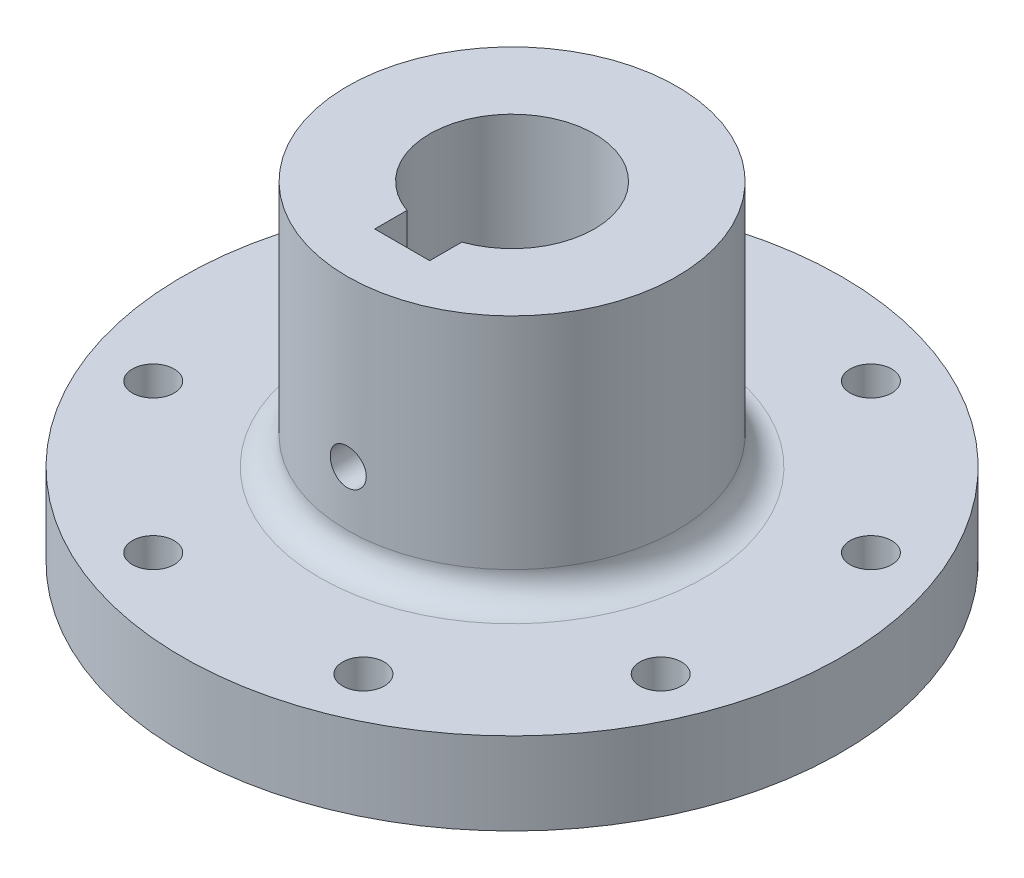
ISO-10303-21;
HEADER;
FILE_DESCRIPTION(('STEP AP214'),'2;1');
FILE_NAME('part.step','',(''),(''),'','','');
FILE_SCHEMA(('AUTOMOTIVE_DESIGN { 1 0 10303 214 1 1 1 1 }'));
ENDSEC;
DATA;
#1=APPLICATION_CONTEXT('core data for automotive mechanical design processes');
#2=APPLICATION_PROTOCOL_DEFINITION('international standard','automotive_design',2000,#1);
#3=PRODUCT_CONTEXT('',#1,'mechanical');
#4=PRODUCT('Part','Part','',(#3));
#5=PRODUCT_RELATED_PRODUCT_CATEGORY('part','',(#4));
#6=PRODUCT_DEFINITION_FORMATION('','',#4);
#7=PRODUCT_DEFINITION_CONTEXT('part definition',#1,'design');
#8=PRODUCT_DEFINITION('design','',#6,#7);
#9=PRODUCT_DEFINITION_SHAPE('','',#8);
#10=(LENGTH_UNIT() NAMED_UNIT(*) SI_UNIT(.MILLI.,.METRE.));
#11=(NAMED_UNIT(*) PLANE_ANGLE_UNIT() SI_UNIT($,.RADIAN.));
#12=(NAMED_UNIT(*) SI_UNIT($,.STERADIAN.) SOLID_ANGLE_UNIT());
#13=UNCERTAINTY_MEASURE_WITH_UNIT(LENGTH_MEASURE(1.E-05),#10,'distance_accuracy_value','');
#14=(GEOMETRIC_REPRESENTATION_CONTEXT(3) GLOBAL_UNCERTAINTY_ASSIGNED_CONTEXT((#13)) GLOBAL_UNIT_ASSIGNED_CONTEXT((#10,
#11,#12)) REPRESENTATION_CONTEXT('',''));
#15=CARTESIAN_POINT('',(0.,0.,0.));
#16=DIRECTION('',(0.,0.,1.));
#17=DIRECTION('',(1.,0.,0.));
#18=AXIS2_PLACEMENT_3D('',#15,#16,#17);
#19=CARTESIAN_POINT('',(0.,38.1,0.));
#20=DIRECTION('',(0.,1.,0.));
#21=DIRECTION('',(0.,0.,1.));
#22=AXIS2_PLACEMENT_3D('',#19,#20,#21);
#23=PLANE('',#22);
#24=DIRECTION('',(0.,0.,-1.));
#25=VECTOR('',#24,1.);
#26=CARTESIAN_POINT('',(3.175,38.1,12.7));
#27=LINE('',#26,#25);
#28=CARTESIAN_POINT('',(3.175,38.1,12.7));
#29=VERTEX_POINT('',#28);
#30=CARTESIAN_POINT('',(3.175,38.1,8.98025612106915));
#31=VERTEX_POINT('',#30);
#32=EDGE_CURVE('E109',#29,#31,#27,.T.);
#33=ORIENTED_EDGE('',*,*,#32,.F.);
#34=DIRECTION('',(1.,0.,0.));
#35=VECTOR('',#34,1.);
#36=CARTESIAN_POINT('',(-3.175,38.1,12.7));
#37=LINE('',#36,#35);
#38=CARTESIAN_POINT('',(-3.175,38.1,12.7));
#39=VERTEX_POINT('',#38);
#40=EDGE_CURVE('E105',#39,#29,#37,.T.);
#41=ORIENTED_EDGE('',*,*,#40,.F.);
#42=DIRECTION('',(0.,0.,1.));
#43=VECTOR('',#42,1.);
#44=CARTESIAN_POINT('',(-3.175,38.1,12.7));
#45=LINE('',#44,#43);
#46=CARTESIAN_POINT('',(-3.175,38.1,8.98025612106915));
#47=VERTEX_POINT('',#46);
#48=EDGE_CURVE('E88',#47,#39,#45,.T.);
#49=ORIENTED_EDGE('',*,*,#48,.F.);
#50=CARTESIAN_POINT('',(0.,38.1,0.));
#51=DIRECTION('',(0.,1.,0.));
#52=DIRECTION('',(0.,0.,1.));
#53=AXIS2_PLACEMENT_3D('',#50,#51,#52);
#54=CIRCLE('',#53,9.525);
#55=EDGE_CURVE('E139',#31,#47,#54,.T.);
#56=ORIENTED_EDGE('',*,*,#55,.F.);
#57=EDGE_LOOP('',(#33,#41,#49,#56));
#58=FACE_BOUND('',#57,.T.);
#59=CARTESIAN_POINT('',(0.,38.1,0.));
#60=DIRECTION('',(0.,1.,0.));
#61=DIRECTION('',(0.,0.,1.));
#62=AXIS2_PLACEMENT_3D('',#59,#60,#61);
#63=CIRCLE('',#62,19.05);
#64=CARTESIAN_POINT('',(0.,38.1,19.05));
#65=VERTEX_POINT('',#64);
#66=EDGE_CURVE('E157',#65,#65,#63,.T.);
#67=ORIENTED_EDGE('',*,*,#66,.T.);
#68=EDGE_LOOP('',(#67));
#69=FACE_BOUND('',#68,.T.);
#70=ADVANCED_FACE('F44',(#58,#69),#23,.T.);
#71=CARTESIAN_POINT('',(0.,38.1,0.));
#72=DIRECTION('',(0.,-1.,0.));
#73=DIRECTION('',(0.,0.,-1.));
#74=AXIS2_PLACEMENT_3D('',#71,#72,#73);
#75=CYLINDRICAL_SURFACE('',#74,38.1);
#76=CARTESIAN_POINT('',(0.,0.,0.));
#77=DIRECTION('',(0.,1.,0.));
#78=DIRECTION('',(0.,0.,1.));
#79=AXIS2_PLACEMENT_3D('',#76,#77,#78);
#80=CIRCLE('',#79,38.1);
#81=CARTESIAN_POINT('',(0.,0.,-38.1));
#82=VERTEX_POINT('',#81);
#83=EDGE_CURVE('E142',#82,#82,#80,.T.);
#84=CARTESIAN_POINT('',(0.,9.525,0.));
#85=DIRECTION('',(0.,1.,0.));
#86=DIRECTION('',(0.,0.,1.));
#87=AXIS2_PLACEMENT_3D('',#84,#85,#86);
#88=CIRCLE('',#87,38.1);
#89=CARTESIAN_POINT('',(0.,9.525,-38.1));
#90=VERTEX_POINT('',#89);
#91=EDGE_CURVE('E220',#90,#90,#88,.T.);
#92=CARTESIAN_POINT('',(0.,0.,-38.1));
#93=CARTESIAN_POINT('',(0.,0.0992187500000001,-38.1));
#94=CARTESIAN_POINT('',(0.,0.1984375,-38.1));
#95=CARTESIAN_POINT('',(0.,0.396875,-38.1));
#96=CARTESIAN_POINT('',(0.,0.49609375,-38.1));
#97=CARTESIAN_POINT('',(0.,0.69453125,-38.1));
#98=CARTESIAN_POINT('',(0.,0.79375,-38.1));
#99=CARTESIAN_POINT('',(0.,0.992187500000001,-38.1));
#100=CARTESIAN_POINT('',(0.,1.09140625,-38.1));
#101=CARTESIAN_POINT('',(0.,1.28984375,-38.1));
#102=CARTESIAN_POINT('',(0.,1.3890625,-38.1));
#103=CARTESIAN_POINT('',(0.,1.5875,-38.1));
#104=CARTESIAN_POINT('',(0.,1.68671875,-38.1));
#105=CARTESIAN_POINT('',(0.,1.88515625,-38.1));
#106=CARTESIAN_POINT('',(0.,1.984375,-38.1));
#107=CARTESIAN_POINT('',(0.,2.1828125,-38.1));
#108=CARTESIAN_POINT('',(0.,2.28203125,-38.1));
#109=CARTESIAN_POINT('',(0.,2.48046875,-38.1));
#110=CARTESIAN_POINT('',(0.,2.5796875,-38.1));
#111=CARTESIAN_POINT('',(0.,2.778125,-38.1));
#112=CARTESIAN_POINT('',(0.,2.87734375,-38.1));
#113=CARTESIAN_POINT('',(0.,3.07578125,-38.1));
#114=CARTESIAN_POINT('',(0.,3.175,-38.1));
#115=CARTESIAN_POINT('',(0.,3.3734375,-38.1));
#116=CARTESIAN_POINT('',(0.,3.47265625,-38.1));
#117=CARTESIAN_POINT('',(0.,3.67109375,-38.1));
#118=CARTESIAN_POINT('',(0.,3.7703125,-38.1));
#119=CARTESIAN_POINT('',(0.,3.96875,-38.1));
#120=CARTESIAN_POINT('',(0.,4.06796875,-38.1));
#121=CARTESIAN_POINT('',(0.,4.26640625,-38.1));
#122=CARTESIAN_POINT('',(0.,4.365625,-38.1));
#123=CARTESIAN_POINT('',(0.,4.5640625,-38.1));
#124=CARTESIAN_POINT('',(0.,4.66328125,-38.1));
#125=CARTESIAN_POINT('',(0.,4.86171875,-38.1));
#126=CARTESIAN_POINT('',(0.,4.9609375,-38.1));
#127=CARTESIAN_POINT('',(0.,5.159375,-38.1));
#128=CARTESIAN_POINT('',(0.,5.25859375,-38.1));
#129=CARTESIAN_POINT('',(0.,5.45703125,-38.1));
#130=CARTESIAN_POINT('',(0.,5.55625,-38.1));
#131=CARTESIAN_POINT('',(0.,5.7546875,-38.1));
#132=CARTESIAN_POINT('',(0.,5.85390625,-38.1));
#133=CARTESIAN_POINT('',(0.,6.05234375,-38.1));
#134=CARTESIAN_POINT('',(0.,6.1515625,-38.1));
#135=CARTESIAN_POINT('',(0.,6.35,-38.1));
#136=CARTESIAN_POINT('',(0.,6.44921875,-38.1));
#137=CARTESIAN_POINT('',(0.,6.64765625,-38.1));
#138=CARTESIAN_POINT('',(0.,6.746875,-38.1));
#139=CARTESIAN_POINT('',(0.,6.9453125,-38.1));
#140=CARTESIAN_POINT('',(0.,7.04453125,-38.1));
#141=CARTESIAN_POINT('',(0.,7.24296874999999,-38.1));
#142=CARTESIAN_POINT('',(0.,7.34218749999999,-38.1));
#143=CARTESIAN_POINT('',(0.,7.54062499999999,-38.1));
#144=CARTESIAN_POINT('',(0.,7.63984374999999,-38.1));
#145=CARTESIAN_POINT('',(0.,7.83828124999999,-38.1));
#146=CARTESIAN_POINT('',(0.,7.93749999999999,-38.1));
#147=CARTESIAN_POINT('',(0.,8.13593749999999,-38.1));
#148=CARTESIAN_POINT('',(0.,8.23515625,-38.1));
#149=CARTESIAN_POINT('',(0.,8.43359374999999,-38.1));
#150=CARTESIAN_POINT('',(0.,8.5328125,-38.1));
#151=CARTESIAN_POINT('',(0.,8.73124999999999,-38.1));
#152=CARTESIAN_POINT('',(0.,8.83046875,-38.1));
#153=CARTESIAN_POINT('',(0.,9.02890625,-38.1));
#154=CARTESIAN_POINT('',(0.,9.128125,-38.1));
#155=CARTESIAN_POINT('',(0.,9.32656249999999,-38.1));
#156=CARTESIAN_POINT('',(0.,9.42578125,-38.1));
#157=CARTESIAN_POINT('',(0.,9.525,-38.1));
#158=B_SPLINE_CURVE_WITH_KNOTS('',3,(#92,#93,#94,#95,#96,#97,#98,#99,#100,#101,#102,#103,#104,
#105,#106,#107,#108,#109,#110,#111,#112,#113,#114,#115,#116,#117,#118,#119,#120,#121,#122,#123,
#124,#125,#126,#127,#128,#129,#130,#131,#132,#133,#134,#135,#136,#137,#138,#139,#140,#141,#142,
#143,#144,#145,#146,#147,#148,#149,#150,#151,#152,#153,#154,#155,#156,#157),.UNSPECIFIED.,.F.,
.F.,(4,2,2,2,2,2,2,2,2,2,2,2,2,2,2,2,2,2,2,2,2,2,2,2,2,2,2,2,2,2,2,2,4),(0.,0.29765625,
0.5953125,0.892968750000001,1.190625,1.48828125,1.7859375,2.08359375,2.38125,2.67890625,
2.9765625,3.27421875,3.571875,3.86953125,4.1671875,4.46484375,4.7625,5.06015625,5.3578125,
5.65546875,5.953125,6.25078125,6.5484375,6.84609375,7.14374999999999,7.44140624999999,
7.73906249999999,8.03671875,8.33437499999999,8.63203125,8.92968749999999,9.22734375,9.525),.UNSPECIFIED.);
#159=EDGE_CURVE('BSEAM176',#82,#90,#158,.T.);
#160=ORIENTED_EDGE('',*,*,#83,.T.);
#161=ORIENTED_EDGE('',*,*,#91,.F.);
#162=ORIENTED_EDGE('',*,*,#159,.T.);
#163=ORIENTED_EDGE('',*,*,#159,.F.);
#164=EDGE_LOOP('',(#160,#162,#161,#163));
#165=FACE_BOUND('',#164,.T.);
#166=ADVANCED_FACE('F176',(#165),#75,.T.);
#167=CARTESIAN_POINT('',(-29.3331751572334,38.1,-12.1501989775914));
#168=DIRECTION('',(0.,1.,0.));
#169=DIRECTION('',(0.,0.,1.));
#170=AXIS2_PLACEMENT_3D('',#167,#168,#169);
#171=CYLINDRICAL_SURFACE('',#170,2.41299999999999);
#172=CARTESIAN_POINT('',(-29.3331751572334,0.,-12.1501989775914));
#173=DIRECTION('',(0.,1.,0.));
#174=DIRECTION('',(0.,0.,1.));
#175=AXIS2_PLACEMENT_3D('',#172,#173,#174);
#176=CIRCLE('',#175,2.41299999999999);
#177=CARTESIAN_POINT('',(-29.3331751572334,0.,-9.73719897759142));
#178=VERTEX_POINT('',#177);
#179=EDGE_CURVE('E136',#178,#178,#176,.T.);
#180=ORIENTED_EDGE('',*,*,#179,.F.);
#181=EDGE_LOOP('',(#180));
#182=FACE_BOUND('',#181,.T.);
#183=CARTESIAN_POINT('',(-29.3331751572334,9.525,-12.1501989775914));
#184=DIRECTION('',(0.,1.,0.));
#185=DIRECTION('',(0.,0.,1.));
#186=AXIS2_PLACEMENT_3D('',#183,#184,#185);
#187=CIRCLE('',#186,2.41299999999999);
#188=CARTESIAN_POINT('',(-29.3331751572334,9.525,-9.73719897759142));
#189=VERTEX_POINT('',#188);
#190=EDGE_CURVE('E222',#189,#189,#187,.F.);
#191=ORIENTED_EDGE('',*,*,#190,.F.);
#192=EDGE_LOOP('',(#191));
#193=FACE_BOUND('',#192,.T.);
#194=ADVANCED_FACE('F182',(#182,#193),#171,.F.);
#195=CARTESIAN_POINT('',(-12.1501989775917,38.1,-29.3331751572333));
#196=DIRECTION('',(0.,1.,0.));
#197=DIRECTION('',(0.,0.,1.));
#198=AXIS2_PLACEMENT_3D('',#195,#196,#197);
#199=CYLINDRICAL_SURFACE('',#198,2.41299999999999);
#200=CARTESIAN_POINT('',(-12.1501989775917,0.,-29.3331751572333));
#201=DIRECTION('',(0.,1.,0.));
#202=DIRECTION('',(0.,0.,1.));
#203=AXIS2_PLACEMENT_3D('',#200,#201,#202);
#204=CIRCLE('',#203,2.41299999999999);
#205=CARTESIAN_POINT('',(-12.1501989775917,0.,-26.9201751572333));
#206=VERTEX_POINT('',#205);
#207=EDGE_CURVE('E133',#206,#206,#204,.T.);
#208=ORIENTED_EDGE('',*,*,#207,.F.);
#209=EDGE_LOOP('',(#208));
#210=FACE_BOUND('',#209,.T.);
#211=CARTESIAN_POINT('',(-12.1501989775917,9.525,-29.3331751572333));
#212=DIRECTION('',(0.,1.,0.));
#213=DIRECTION('',(0.,0.,1.));
#214=AXIS2_PLACEMENT_3D('',#211,#212,#213);
#215=CIRCLE('',#214,2.41299999999999);
#216=CARTESIAN_POINT('',(-12.1501989775917,9.525,-26.9201751572333));
#217=VERTEX_POINT('',#216);
#218=EDGE_CURVE('E226',#217,#217,#215,.F.);
#219=ORIENTED_EDGE('',*,*,#218,.F.);
#220=EDGE_LOOP('',(#219));
#221=FACE_BOUND('',#220,.T.);
#222=ADVANCED_FACE('F285',(#210,#221),#199,.F.);
#223=CARTESIAN_POINT('',(12.1501989775915,38.1,-29.3331751572334));
#224=DIRECTION('',(0.,1.,0.));
#225=DIRECTION('',(0.,0.,1.));
#226=AXIS2_PLACEMENT_3D('',#223,#224,#225);
#227=CYLINDRICAL_SURFACE('',#226,2.41299999999999);
#228=CARTESIAN_POINT('',(12.1501989775915,0.,-29.3331751572334));
#229=DIRECTION('',(0.,1.,0.));
#230=DIRECTION('',(0.,0.,1.));
#231=AXIS2_PLACEMENT_3D('',#228,#229,#230);
#232=CIRCLE('',#231,2.41299999999999);
#233=CARTESIAN_POINT('',(12.1501989775915,0.,-26.9201751572334));
#234=VERTEX_POINT('',#233);
#235=EDGE_CURVE('E130',#234,#234,#232,.T.);
#236=ORIENTED_EDGE('',*,*,#235,.F.);
#237=EDGE_LOOP('',(#236));
#238=FACE_BOUND('',#237,.T.);
#239=CARTESIAN_POINT('',(12.1501989775915,9.525,-29.3331751572334));
#240=DIRECTION('',(0.,1.,0.));
#241=DIRECTION('',(0.,0.,1.));
#242=AXIS2_PLACEMENT_3D('',#239,#240,#241);
#243=CIRCLE('',#242,2.41299999999999);
#244=CARTESIAN_POINT('',(12.1501989775915,9.525,-26.9201751572334));
#245=VERTEX_POINT('',#244);
#246=EDGE_CURVE('E231',#245,#245,#243,.F.);
#247=ORIENTED_EDGE('',*,*,#246,.F.);
#248=EDGE_LOOP('',(#247));
#249=FACE_BOUND('',#248,.T.);
#250=ADVANCED_FACE('F281',(#238,#249),#227,.F.);
#251=CARTESIAN_POINT('',(29.3331751572333,38.1,-12.1501989775916));
#252=DIRECTION('',(0.,1.,0.));
#253=DIRECTION('',(0.,0.,1.));
#254=AXIS2_PLACEMENT_3D('',#251,#252,#253);
#255=CYLINDRICAL_SURFACE('',#254,2.41299999999999);
#256=CARTESIAN_POINT('',(29.3331751572333,0.,-12.1501989775916));
#257=DIRECTION('',(0.,1.,0.));
#258=DIRECTION('',(0.,0.,1.));
#259=AXIS2_PLACEMENT_3D('',#256,#257,#258);
#260=CIRCLE('',#259,2.41299999999999);
#261=CARTESIAN_POINT('',(29.3331751572333,0.,-9.73719897759164));
#262=VERTEX_POINT('',#261);
#263=EDGE_CURVE('E127',#262,#262,#260,.T.);
#264=ORIENTED_EDGE('',*,*,#263,.F.);
#265=EDGE_LOOP('',(#264));
#266=FACE_BOUND('',#265,.T.);
#267=CARTESIAN_POINT('',(29.3331751572333,9.525,-12.1501989775916));
#268=DIRECTION('',(0.,1.,0.));
#269=DIRECTION('',(0.,0.,1.));
#270=AXIS2_PLACEMENT_3D('',#267,#268,#269);
#271=CIRCLE('',#270,2.41299999999999);
#272=CARTESIAN_POINT('',(29.3331751572333,9.525,-9.73719897759164));
#273=VERTEX_POINT('',#272);
#274=EDGE_CURVE('E234',#273,#273,#271,.F.);
#275=ORIENTED_EDGE('',*,*,#274,.F.);
#276=EDGE_LOOP('',(#275));
#277=FACE_BOUND('',#276,.T.);
#278=ADVANCED_FACE('F277',(#266,#277),#255,.F.);
#279=CARTESIAN_POINT('',(29.3331751572334,38.1,12.1501989775914));
#280=DIRECTION('',(0.,1.,0.));
#281=DIRECTION('',(0.,0.,1.));
#282=AXIS2_PLACEMENT_3D('',#279,#280,#281);
#283=CYLINDRICAL_SURFACE('',#282,2.41299999999999);
#284=CARTESIAN_POINT('',(29.3331751572334,0.,12.1501989775914));
#285=DIRECTION('',(0.,1.,0.));
#286=DIRECTION('',(0.,0.,1.));
#287=AXIS2_PLACEMENT_3D('',#284,#285,#286);
#288=CIRCLE('',#287,2.41299999999999);
#289=CARTESIAN_POINT('',(29.3331751572334,0.,14.5631989775914));
#290=VERTEX_POINT('',#289);
#291=EDGE_CURVE('E124',#290,#290,#288,.T.);
#292=ORIENTED_EDGE('',*,*,#291,.F.);
#293=EDGE_LOOP('',(#292));
#294=FACE_BOUND('',#293,.T.);
#295=CARTESIAN_POINT('',(29.3331751572334,9.525,12.1501989775914));
#296=DIRECTION('',(0.,1.,0.));
#297=DIRECTION('',(0.,0.,1.));
#298=AXIS2_PLACEMENT_3D('',#295,#296,#297);
#299=CIRCLE('',#298,2.41299999999999);
#300=CARTESIAN_POINT('',(29.3331751572334,9.525,14.5631989775914));
#301=VERTEX_POINT('',#300);
#302=EDGE_CURVE('E237',#301,#301,#299,.F.);
#303=ORIENTED_EDGE('',*,*,#302,.F.);
#304=EDGE_LOOP('',(#303));
#305=FACE_BOUND('',#304,.T.);
#306=ADVANCED_FACE('F273',(#294,#305),#283,.F.);
#307=CARTESIAN_POINT('',(12.1501989775915,38.1,29.3331751572334));
#308=DIRECTION('',(0.,1.,0.));
#309=DIRECTION('',(0.,0.,1.));
#310=AXIS2_PLACEMENT_3D('',#307,#308,#309);
#311=CYLINDRICAL_SURFACE('',#310,2.41299999999999);
#312=CARTESIAN_POINT('',(12.1501989775915,0.,29.3331751572334));
#313=DIRECTION('',(0.,1.,0.));
#314=DIRECTION('',(0.,0.,1.));
#315=AXIS2_PLACEMENT_3D('',#312,#313,#314);
#316=CIRCLE('',#315,2.41299999999999);
#317=CARTESIAN_POINT('',(12.1501989775915,0.,31.7461751572334));
#318=VERTEX_POINT('',#317);
#319=EDGE_CURVE('E121',#318,#318,#316,.T.);
#320=ORIENTED_EDGE('',*,*,#319,.F.);
#321=EDGE_LOOP('',(#320));
#322=FACE_BOUND('',#321,.T.);
#323=CARTESIAN_POINT('',(12.1501989775915,9.525,29.3331751572334));
#324=DIRECTION('',(0.,1.,0.));
#325=DIRECTION('',(0.,0.,1.));
#326=AXIS2_PLACEMENT_3D('',#323,#324,#325);
#327=CIRCLE('',#326,2.41299999999999);
#328=CARTESIAN_POINT('',(12.1501989775915,9.525,31.7461751572334));
#329=VERTEX_POINT('',#328);
#330=EDGE_CURVE('E240',#329,#329,#327,.F.);
#331=ORIENTED_EDGE('',*,*,#330,.F.);
#332=EDGE_LOOP('',(#331));
#333=FACE_BOUND('',#332,.T.);
#334=ADVANCED_FACE('F266',(#322,#333),#311,.F.);
#335=CARTESIAN_POINT('',(-12.1501989775917,38.1,29.3331751572333));
#336=DIRECTION('',(0.,1.,0.));
#337=DIRECTION('',(0.,0.,1.));
#338=AXIS2_PLACEMENT_3D('',#335,#336,#337);
#339=CYLINDRICAL_SURFACE('',#338,2.41299999999999);
#340=CARTESIAN_POINT('',(-12.1501989775917,0.,29.3331751572333));
#341=DIRECTION('',(0.,1.,0.));
#342=DIRECTION('',(0.,0.,1.));
#343=AXIS2_PLACEMENT_3D('',#340,#341,#342);
#344=CIRCLE('',#343,2.41299999999999);
#345=CARTESIAN_POINT('',(-12.1501989775917,0.,31.7461751572333));
#346=VERTEX_POINT('',#345);
#347=EDGE_CURVE('E118',#346,#346,#344,.T.);
#348=ORIENTED_EDGE('',*,*,#347,.F.);
#349=EDGE_LOOP('',(#348));
#350=FACE_BOUND('',#349,.T.);
#351=CARTESIAN_POINT('',(-12.1501989775917,9.525,29.3331751572333));
#352=DIRECTION('',(0.,1.,0.));
#353=DIRECTION('',(0.,0.,1.));
#354=AXIS2_PLACEMENT_3D('',#351,#352,#353);
#355=CIRCLE('',#354,2.41299999999999);
#356=CARTESIAN_POINT('',(-12.1501989775917,9.525,31.7461751572333));
#357=VERTEX_POINT('',#356);
#358=EDGE_CURVE('E243',#357,#357,#355,.F.);
#359=ORIENTED_EDGE('',*,*,#358,.F.);
#360=EDGE_LOOP('',(#359));
#361=FACE_BOUND('',#360,.T.);
#362=ADVANCED_FACE('F260',(#350,#361),#339,.F.);
#363=CARTESIAN_POINT('',(-29.3331751572334,38.1,12.1501989775914));
#364=DIRECTION('',(0.,1.,0.));
#365=DIRECTION('',(0.,0.,1.));
#366=AXIS2_PLACEMENT_3D('',#363,#364,#365);
#367=CYLINDRICAL_SURFACE('',#366,2.41299999999999);
#368=CARTESIAN_POINT('',(-29.3331751572334,0.,12.1501989775914));
#369=DIRECTION('',(0.,1.,0.));
#370=DIRECTION('',(0.,0.,1.));
#371=AXIS2_PLACEMENT_3D('',#368,#369,#370);
#372=CIRCLE('',#371,2.41299999999999);
#373=CARTESIAN_POINT('',(-29.3331751572334,0.,14.5631989775914));
#374=VERTEX_POINT('',#373);
#375=EDGE_CURVE('E114',#374,#374,#372,.T.);
#376=ORIENTED_EDGE('',*,*,#375,.F.);
#377=EDGE_LOOP('',(#376));
#378=FACE_BOUND('',#377,.T.);
#379=CARTESIAN_POINT('',(-29.3331751572334,9.525,12.1501989775914));
#380=DIRECTION('',(0.,1.,0.));
#381=DIRECTION('',(0.,0.,1.));
#382=AXIS2_PLACEMENT_3D('',#379,#380,#381);
#383=CIRCLE('',#382,2.41299999999999);
#384=CARTESIAN_POINT('',(-29.3331751572334,9.525,14.5631989775914));
#385=VERTEX_POINT('',#384);
#386=EDGE_CURVE('E156',#385,#385,#383,.F.);
#387=ORIENTED_EDGE('',*,*,#386,.F.);
#388=EDGE_LOOP('',(#387));
#389=FACE_BOUND('',#388,.T.);
#390=ADVANCED_FACE('F198',(#378,#389),#367,.F.);
#391=CARTESIAN_POINT('',(0.,19.05,12.7));
#392=DIRECTION('',(0.,0.,-1.));
#393=DIRECTION('',(-1.,0.,0.));
#394=AXIS2_PLACEMENT_3D('',#391,#392,#393);
#395=CYLINDRICAL_SURFACE('',#394,2.08279999999999);
#396=CARTESIAN_POINT('',(0.,19.05,12.7));
#397=DIRECTION('',(0.,0.,-1.));
#398=DIRECTION('',(-1.,0.,0.));
#399=AXIS2_PLACEMENT_3D('',#396,#397,#398);
#400=CIRCLE('',#399,2.08279999999999);
#401=CARTESIAN_POINT('',(-2.08279999999999,19.05,12.7));
#402=VERTEX_POINT('',#401);
#403=EDGE_CURVE('E111',#402,#402,#400,.T.);
#404=ORIENTED_EDGE('',*,*,#403,.T.);
#405=EDGE_LOOP('',(#404));
#406=FACE_BOUND('',#405,.T.);
#407=CARTESIAN_POINT('',(-2.08279999999999,19.05,18.9357979541397));
#408=CARTESIAN_POINT('',(-2.08279497881166,19.1666160510779,18.9357994394902));
#409=CARTESIAN_POINT('',(-2.07297298676526,19.283307744794,18.9368868412433));
#410=CARTESIAN_POINT('',(-2.03394189709669,19.5134515701635,18.9411179932));
#411=CARTESIAN_POINT('',(-2.00471181864688,19.6269000572057,18.9442639687414));
#412=CARTESIAN_POINT('',(-1.92772960823089,19.8471915685561,18.952251760746));
#413=CARTESIAN_POINT('',(-1.87998917113471,19.9540387142835,18.9570925062642));
#414=CARTESIAN_POINT('',(-1.76736482855803,20.1581819894046,18.9679231009634));
#415=CARTESIAN_POINT('',(-1.70248416255462,20.2554799188249,18.9739127329482));
#416=CARTESIAN_POINT('',(-1.55712055669183,20.4382048400864,18.986395182468));
#417=CARTESIAN_POINT('',(-1.47657856918387,20.5235847362629,18.992889846688));
#418=CARTESIAN_POINT('',(-1.30230520730704,20.6796439560543,19.0056338741933));
#419=CARTESIAN_POINT('',(-1.20857321188593,20.7503225870708,19.0118832259103));
#420=CARTESIAN_POINT('',(-1.01028898963088,20.8751382300592,19.0234510110421));
#421=CARTESIAN_POINT('',(-0.905710136444054,20.9292331824381,19.0287670630787));
#422=CARTESIAN_POINT('',(-0.688885148967421,21.0190767369682,19.0378490970069));
#423=CARTESIAN_POINT('',(-0.576639235504375,21.0548258672636,19.0416151235205));
#424=CARTESIAN_POINT('',(-0.34814471626406,21.1068238253125,19.0471597964869));
#425=CARTESIAN_POINT('',(-0.231914000281076,21.1231504079309,19.0489463653747));
#426=CARTESIAN_POINT('',(0.00165052547901525,21.1360805416822,19.0503578111117));
#427=CARTESIAN_POINT('',(0.118984301393396,21.1326846963109,19.0499827541055));
#428=CARTESIAN_POINT('',(0.350896025263309,21.1063292057281,19.0471196643233));
#429=CARTESIAN_POINT('',(0.465483602550117,21.0834531741685,19.0446406623378));
#430=CARTESIAN_POINT('',(0.689183280128216,21.0189170923193,19.0378585255032));
#431=CARTESIAN_POINT('',(0.798295297517407,20.9772567577234,19.033555363045));
#432=CARTESIAN_POINT('',(1.00820849297357,20.87624393835,19.0235930345332));
#433=CARTESIAN_POINT('',(1.10899186412914,20.8168547375991,19.0179310592358));
#434=CARTESIAN_POINT('',(1.29919261266748,20.6820967015637,19.0058857866883));
#435=CARTESIAN_POINT('',(1.38860959104489,20.6067273055589,18.9995024641311));
#436=CARTESIAN_POINT('',(1.55402959817567,20.4416787600104,18.9866907506806));
#437=CARTESIAN_POINT('',(1.62996001981692,20.3519268260512,18.9802622986918));
#438=CARTESIAN_POINT('',(1.76568864943803,20.1609124713301,18.9681180373279));
#439=CARTESIAN_POINT('',(1.82548682585347,20.0596500280471,18.9624022293471));
#440=CARTESIAN_POINT('',(1.92725472009082,19.8484302384305,18.9523301433988));
#441=CARTESIAN_POINT('',(1.96921949118784,19.7384704896114,18.9479742427385));
#442=CARTESIAN_POINT('',(2.03406949445042,19.5130071078918,18.9411228343886));
#443=CARTESIAN_POINT('',(2.05695542439593,19.3975036779064,18.9386272586608));
#444=CARTESIAN_POINT('',(2.08290374429974,19.164870399302,18.9357911003749));
#445=CARTESIAN_POINT('',(2.08606792073502,19.0477520336592,18.9354394529362));
#446=CARTESIAN_POINT('',(2.07275066359024,18.8146530533433,18.9369017475912));
#447=CARTESIAN_POINT('',(2.05626954841636,18.698672420261,18.9387156545861));
#448=CARTESIAN_POINT('',(2.00421489687658,18.4714407516807,18.9442946021943));
#449=CARTESIAN_POINT('',(1.96868989121359,18.3601784664625,18.9480546824202));
#450=CARTESIAN_POINT('',(1.87960556973992,18.1451913553282,18.9570982926293));
#451=CARTESIAN_POINT('',(1.82604576317258,18.0414667346177,18.9623818640687));
#452=CARTESIAN_POINT('',(1.70215886671492,17.8440365566456,18.9739038270057));
#453=CARTESIAN_POINT('',(1.63176457032365,17.7503733959728,18.9801460087727));
#454=CARTESIAN_POINT('',(1.4763027945889,17.5761557433167,18.9928696373869));
#455=CARTESIAN_POINT('',(1.39123488036923,17.4956016399787,18.9993510913209));
#456=CARTESIAN_POINT('',(1.20839798555545,17.3495354488174,19.0118565845615));
#457=CARTESIAN_POINT('',(1.1105756591229,17.28408993107,19.0178785240967));
#458=CARTESIAN_POINT('',(0.905268823298068,17.1705576329213,19.0287556375173));
#459=CARTESIAN_POINT('',(0.797784468531103,17.1224705747875,19.03361083007));
#460=CARTESIAN_POINT('',(0.576433139928782,17.0451320155167,19.04159798174));
#461=CARTESIAN_POINT('',(0.462580138601823,17.0158409128083,19.0447335619017));
#462=CARTESIAN_POINT('',(0.231535801707043,16.9767966218766,19.0489431189147));
#463=CARTESIAN_POINT('',(0.114344579749443,16.9670427695425,19.0500171658417));
#464=CARTESIAN_POINT('',(-0.119397071381483,16.9673602505668,19.0499825038311));
#465=CARTESIAN_POINT('',(-0.235947655893809,16.9773284867517,19.0488851459035));
#466=CARTESIAN_POINT('',(-0.46570748705936,17.016590240262,19.044653414605));
#467=CARTESIAN_POINT('',(-0.578916732604285,17.0458837639974,19.0415190405583));
#468=CARTESIAN_POINT('',(-0.798774989074803,17.1229346222537,19.0335642228597));
#469=CARTESIAN_POINT('',(-0.905425310388249,17.1706882547037,19.0287441172901));
#470=CARTESIAN_POINT('',(-1.10921376171623,17.2832929892896,19.0179538920679));
#471=CARTESIAN_POINT('',(-1.20635188792606,17.3481440982643,19.0119837719553));
#472=CARTESIAN_POINT('',(-1.38888655815051,17.4934880415122,18.9995241929614));
#473=CARTESIAN_POINT('',(-1.4742217685392,17.5740576957346,18.9930322795095));
#474=CARTESIAN_POINT('',(-1.6302042857453,17.7483962230291,18.980281229886));
#475=CARTESIAN_POINT('',(-1.70084808074393,17.8421682430165,18.9740221496634));
#476=CARTESIAN_POINT('',(-1.82561501888089,18.0405628245285,18.9624254715748));
#477=CARTESIAN_POINT('',(-1.87968815466371,18.1452169781139,18.9570906837117));
#478=CARTESIAN_POINT('',(-1.96941949629743,18.3621142863481,18.9479798262051));
#479=CARTESIAN_POINT('',(-2.00509821588714,18.4743488284917,18.9442020211378));
#480=CARTESIAN_POINT('',(-2.04825342777323,18.6643338654714,18.9395733548007));
#481=CARTESIAN_POINT('',(-2.06119037052366,18.7408750025478,18.9381643969165));
#482=CARTESIAN_POINT('',(-2.07846530348686,18.8949329459979,18.9362762051584));
#483=CARTESIAN_POINT('',(-2.08280333911515,18.9724497472164,18.9357969663742));
#484=CARTESIAN_POINT('',(-2.08279999999999,19.05,18.9357979541397));
#485=B_SPLINE_CURVE_WITH_KNOTS('',3,(#407,#408,#409,#410,#411,#412,#413,#414,#415,#416,#417,
#418,#419,#420,#421,#422,#423,#424,#425,#426,#427,#428,#429,#430,#431,#432,#433,#434,#435,#436,
#437,#438,#439,#440,#441,#442,#443,#444,#445,#446,#447,#448,#449,#450,#451,#452,#453,#454,#455,
#456,#457,#458,#459,#460,#461,#462,#463,#464,#465,#466,#467,#468,#469,#470,#471,#472,#473,#474,
#475,#476,#477,#478,#479,#480,#481,#482,#483,#484),.UNSPECIFIED.,.T.,.F.,(4,2,2,2,2,2,2,2,2,2,2,
2,2,2,2,2,2,2,2,2,2,2,2,2,2,2,2,2,2,2,2,2,2,2,2,2,2,2,4),(0.,0.349564918778832,
0.699508346191483,1.04923103819503,1.39888768037216,1.74988912513953,2.10090710236235,
2.45280810507661,2.80469897660423,3.15517632067064,3.50564294037581,3.8546128116377,
4.20358796484573,4.55329090947695,4.90300612667714,5.25455050902611,5.60609557920321,
5.95773809927339,6.30936775798232,6.65918109823877,7.00898876888128,7.35790921183897,
7.70683915026428,8.05718604738051,8.40754332937322,8.75941605228159,9.1112831450317,
9.46240642653968,9.81351777245391,10.162798533797,10.512079410993,10.861290278183,
11.2105012850505,11.5614637648733,11.9125100421724,12.2646055136454,12.616307468745,
12.8487711025482,13.0812335085806),.UNSPECIFIED.);
#486=CARTESIAN_POINT('',(-2.08279999999999,19.05,18.9357979541397));
#487=VERTEX_POINT('',#486);
#488=EDGE_CURVE('E149',#487,#487,#485,.T.);
#489=ORIENTED_EDGE('',*,*,#488,.F.);
#490=EDGE_LOOP('',(#489));
#491=FACE_BOUND('',#490,.T.);
#492=ADVANCED_FACE('F158',(#406,#491),#395,.F.);
#493=CARTESIAN_POINT('',(0.,0.,0.));
#494=DIRECTION('',(0.,1.,0.));
#495=DIRECTION('',(0.,0.,1.));
#496=AXIS2_PLACEMENT_3D('',#493,#494,#495);
#497=PLANE('',#496);
#498=ORIENTED_EDGE('',*,*,#375,.T.);
#499=EDGE_LOOP('',(#498));
#500=FACE_BOUND('',#499,.T.);
#501=ORIENTED_EDGE('',*,*,#347,.T.);
#502=EDGE_LOOP('',(#501));
#503=FACE_BOUND('',#502,.T.);
#504=ORIENTED_EDGE('',*,*,#319,.T.);
#505=EDGE_LOOP('',(#504));
#506=FACE_BOUND('',#505,.T.);
#507=ORIENTED_EDGE('',*,*,#291,.T.);
#508=EDGE_LOOP('',(#507));
#509=FACE_BOUND('',#508,.T.);
#510=ORIENTED_EDGE('',*,*,#263,.T.);
#511=EDGE_LOOP('',(#510));
#512=FACE_BOUND('',#511,.T.);
#513=ORIENTED_EDGE('',*,*,#235,.T.);
#514=EDGE_LOOP('',(#513));
#515=FACE_BOUND('',#514,.T.);
#516=ORIENTED_EDGE('',*,*,#207,.T.);
#517=EDGE_LOOP('',(#516));
#518=FACE_BOUND('',#517,.T.);
#519=ORIENTED_EDGE('',*,*,#179,.T.);
#520=EDGE_LOOP('',(#519));
#521=FACE_BOUND('',#520,.T.);
#522=ORIENTED_EDGE('',*,*,#83,.F.);
#523=EDGE_LOOP('',(#522));
#524=FACE_BOUND('',#523,.T.);
#525=DIRECTION('',(1.,0.,0.));
#526=VECTOR('',#525,1.);
#527=CARTESIAN_POINT('',(-3.175,0.,12.7));
#528=LINE('',#527,#526);
#529=CARTESIAN_POINT('',(-3.175,0.,12.7));
#530=VERTEX_POINT('',#529);
#531=CARTESIAN_POINT('',(3.175,0.,12.7));
#532=VERTEX_POINT('',#531);
#533=EDGE_CURVE('E93',#530,#532,#528,.T.);
#534=ORIENTED_EDGE('',*,*,#533,.T.);
#535=DIRECTION('',(0.,0.,-1.));
#536=VECTOR('',#535,1.);
#537=CARTESIAN_POINT('',(3.175,0.,12.7));
#538=LINE('',#537,#536);
#539=CARTESIAN_POINT('',(3.175,0.,8.98025612106915));
#540=VERTEX_POINT('',#539);
#541=EDGE_CURVE('E103',#532,#540,#538,.T.);
#542=ORIENTED_EDGE('',*,*,#541,.T.);
#543=CARTESIAN_POINT('',(0.,0.,0.));
#544=DIRECTION('',(0.,1.,0.));
#545=DIRECTION('',(0.,0.,1.));
#546=AXIS2_PLACEMENT_3D('',#543,#544,#545);
#547=CIRCLE('',#546,9.525);
#548=CARTESIAN_POINT('',(-3.175,0.,8.98025612106915));
#549=VERTEX_POINT('',#548);
#550=EDGE_CURVE('E102',#540,#549,#547,.T.);
#551=ORIENTED_EDGE('',*,*,#550,.T.);
#552=DIRECTION('',(0.,0.,1.));
#553=VECTOR('',#552,1.);
#554=CARTESIAN_POINT('',(-3.175,0.,12.7));
#555=LINE('',#554,#553);
#556=EDGE_CURVE('E59',#549,#530,#555,.T.);
#557=ORIENTED_EDGE('',*,*,#556,.T.);
#558=EDGE_LOOP('',(#534,#542,#551,#557));
#559=FACE_BOUND('',#558,.T.);
#560=ADVANCED_FACE('F100',(#500,#503,#506,#509,#512,#515,#518,#521,#524,#559),#497,.F.);
#561=CARTESIAN_POINT('',(0.,38.1,0.));
#562=DIRECTION('',(0.,-1.,0.));
#563=DIRECTION('',(0.,0.,-1.));
#564=AXIS2_PLACEMENT_3D('',#561,#562,#563);
#565=CYLINDRICAL_SURFACE('',#564,9.525);
#566=DIRECTION('',(0.,-1.,0.));
#567=VECTOR('',#566,1.);
#568=CARTESIAN_POINT('',(3.175,38.1,8.98025612106915));
#569=LINE('',#568,#567);
#570=EDGE_CURVE('E67',#31,#540,#569,.T.);
#571=ORIENTED_EDGE('',*,*,#570,.F.);
#572=ORIENTED_EDGE('',*,*,#55,.T.);
#573=DIRECTION('',(0.,-1.,0.));
#574=VECTOR('',#573,1.);
#575=CARTESIAN_POINT('',(-3.175,38.1,8.98025612106915));
#576=LINE('',#575,#574);
#577=EDGE_CURVE('E146',#549,#47,#576,.F.);
#578=ORIENTED_EDGE('',*,*,#577,.F.);
#579=ORIENTED_EDGE('',*,*,#550,.F.);
#580=EDGE_LOOP('',(#571,#572,#578,#579));
#581=FACE_BOUND('',#580,.T.);
#582=ADVANCED_FACE('F188',(#581),#565,.F.);
#583=CARTESIAN_POINT('',(3.175,0.,12.7));
#584=DIRECTION('',(1.,0.,0.));
#585=DIRECTION('',(0.,0.,-1.));
#586=AXIS2_PLACEMENT_3D('',#583,#584,#585);
#587=PLANE('',#586);
#588=ORIENTED_EDGE('',*,*,#570,.T.);
#589=ORIENTED_EDGE('',*,*,#541,.F.);
#590=DIRECTION('',(0.,1.,0.));
#591=VECTOR('',#590,1.);
#592=CARTESIAN_POINT('',(3.175,0.,12.7));
#593=LINE('',#592,#591);
#594=EDGE_CURVE('E92',#532,#29,#593,.T.);
#595=ORIENTED_EDGE('',*,*,#594,.T.);
#596=ORIENTED_EDGE('',*,*,#32,.T.);
#597=EDGE_LOOP('',(#588,#589,#595,#596));
#598=FACE_BOUND('',#597,.T.);
#599=ADVANCED_FACE('F196',(#598),#587,.F.);
#600=CARTESIAN_POINT('',(-3.175,0.,12.7));
#601=DIRECTION('',(0.,0.,1.));
#602=DIRECTION('',(1.,0.,0.));
#603=AXIS2_PLACEMENT_3D('',#600,#601,#602);
#604=PLANE('',#603);
#605=ORIENTED_EDGE('',*,*,#403,.F.);
#606=EDGE_LOOP('',(#605));
#607=FACE_BOUND('',#606,.T.);
#608=ORIENTED_EDGE('',*,*,#40,.T.);
#609=ORIENTED_EDGE('',*,*,#594,.F.);
#610=ORIENTED_EDGE('',*,*,#533,.F.);
#611=DIRECTION('',(0.,1.,0.));
#612=VECTOR('',#611,1.);
#613=CARTESIAN_POINT('',(-3.175,0.,12.7));
#614=LINE('',#613,#612);
#615=EDGE_CURVE('E84',#530,#39,#614,.T.);
#616=ORIENTED_EDGE('',*,*,#615,.T.);
#617=EDGE_LOOP('',(#608,#609,#610,#616));
#618=FACE_BOUND('',#617,.T.);
#619=ADVANCED_FACE('F96',(#607,#618),#604,.F.);
#620=CARTESIAN_POINT('',(-3.175,0.,12.7));
#621=DIRECTION('',(-1.,0.,0.));
#622=DIRECTION('',(0.,0.,1.));
#623=AXIS2_PLACEMENT_3D('',#620,#621,#622);
#624=PLANE('',#623);
#625=ORIENTED_EDGE('',*,*,#577,.T.);
#626=ORIENTED_EDGE('',*,*,#48,.T.);
#627=ORIENTED_EDGE('',*,*,#615,.F.);
#628=ORIENTED_EDGE('',*,*,#556,.F.);
#629=EDGE_LOOP('',(#625,#626,#627,#628));
#630=FACE_BOUND('',#629,.T.);
#631=ADVANCED_FACE('F86',(#630),#624,.F.);
#632=CARTESIAN_POINT('',(0.,9.525,0.));
#633=DIRECTION('',(0.,1.,0.));
#634=DIRECTION('',(0.,0.,1.));
#635=AXIS2_PLACEMENT_3D('',#632,#633,#634);
#636=PLANE('',#635);
#637=CARTESIAN_POINT('',(0.,9.525,0.));
#638=DIRECTION('',(0.,1.,0.));
#639=DIRECTION('',(0.,0.,1.));
#640=AXIS2_PLACEMENT_3D('',#637,#638,#639);
#641=CIRCLE('',#640,22.225);
#642=CARTESIAN_POINT('',(0.,9.525,22.225));
#643=VERTEX_POINT('',#642);
#644=EDGE_CURVE('E52',#643,#643,#641,.F.);
#645=ORIENTED_EDGE('',*,*,#644,.T.);
#646=EDGE_LOOP('',(#645));
#647=FACE_BOUND('',#646,.T.);
#648=ORIENTED_EDGE('',*,*,#190,.T.);
#649=EDGE_LOOP('',(#648));
#650=FACE_BOUND('',#649,.T.);
#651=ORIENTED_EDGE('',*,*,#246,.T.);
#652=EDGE_LOOP('',(#651));
#653=FACE_BOUND('',#652,.T.);
#654=ORIENTED_EDGE('',*,*,#302,.T.);
#655=EDGE_LOOP('',(#654));
#656=FACE_BOUND('',#655,.T.);
#657=ORIENTED_EDGE('',*,*,#358,.T.);
#658=EDGE_LOOP('',(#657));
#659=FACE_BOUND('',#658,.T.);
#660=ORIENTED_EDGE('',*,*,#386,.T.);
#661=EDGE_LOOP('',(#660));
#662=FACE_BOUND('',#661,.T.);
#663=ORIENTED_EDGE('',*,*,#330,.T.);
#664=EDGE_LOOP('',(#663));
#665=FACE_BOUND('',#664,.T.);
#666=ORIENTED_EDGE('',*,*,#274,.T.);
#667=EDGE_LOOP('',(#666));
#668=FACE_BOUND('',#667,.T.);
#669=ORIENTED_EDGE('',*,*,#218,.T.);
#670=EDGE_LOOP('',(#669));
#671=FACE_BOUND('',#670,.T.);
#672=ORIENTED_EDGE('',*,*,#91,.T.);
#673=EDGE_LOOP('',(#672));
#674=FACE_BOUND('',#673,.T.);
#675=ADVANCED_FACE('F165',(#647,#650,#653,#656,#659,#662,#665,#668,#671,#674),#636,.T.);
#676=CARTESIAN_POINT('',(0.,-108.840704187358,0.));
#677=DIRECTION('',(0.,1.,0.));
#678=DIRECTION('',(0.,0.,1.));
#679=AXIS2_PLACEMENT_3D('',#676,#677,#678);
#680=CYLINDRICAL_SURFACE('',#679,19.05);
#681=CARTESIAN_POINT('',(0.,12.7,0.));
#682=DIRECTION('',(0.,1.,0.));
#683=DIRECTION('',(0.,0.,1.));
#684=AXIS2_PLACEMENT_3D('',#681,#682,#683);
#685=CIRCLE('',#684,19.05);
#686=CARTESIAN_POINT('',(0.,12.7,19.05));
#687=VERTEX_POINT('',#686);
#688=EDGE_CURVE('E13',#687,#687,#685,.T.);
#689=ORIENTED_EDGE('',*,*,#688,.T.);
#690=EDGE_LOOP('',(#689));
#691=FACE_BOUND('',#690,.T.);
#692=ORIENTED_EDGE('',*,*,#66,.F.);
#693=EDGE_LOOP('',(#692));
#694=FACE_BOUND('',#693,.T.);
#695=ORIENTED_EDGE('',*,*,#488,.T.);
#696=EDGE_LOOP('',(#695));
#697=FACE_BOUND('',#696,.T.);
#698=ADVANCED_FACE('F161',(#691,#694,#697),#680,.T.);
#699=CARTESIAN_POINT('',(0.,12.7,0.));
#700=DIRECTION('',(0.,1.,0.));
#701=DIRECTION('',(0.,0.,1.));
#702=AXIS2_PLACEMENT_3D('',#699,#700,#701);
#703=TOROIDAL_SURFACE('',#702,22.225,3.175);
#704=ORIENTED_EDGE('',*,*,#688,.F.);
#705=EDGE_LOOP('',(#704));
#706=FACE_BOUND('',#705,.T.);
#707=ORIENTED_EDGE('',*,*,#644,.F.);
#708=EDGE_LOOP('',(#707));
#709=FACE_BOUND('',#708,.T.);
#710=ADVANCED_FACE('F46',(#706,#709),#703,.F.);
#711=CLOSED_SHELL('',(#70,#166,#194,#222,#250,#278,#306,#334,#362,#390,#492,#560,#582,#599,#619,
#631,#675,#698,#710));
#712=MANIFOLD_SOLID_BREP('B2',#711);
#713=ADVANCED_BREP_SHAPE_REPRESENTATION('',(#18,#712),#14);
#714=SHAPE_DEFINITION_REPRESENTATION(#9,#713);
ENDSEC;
END-ISO-10303-21;
